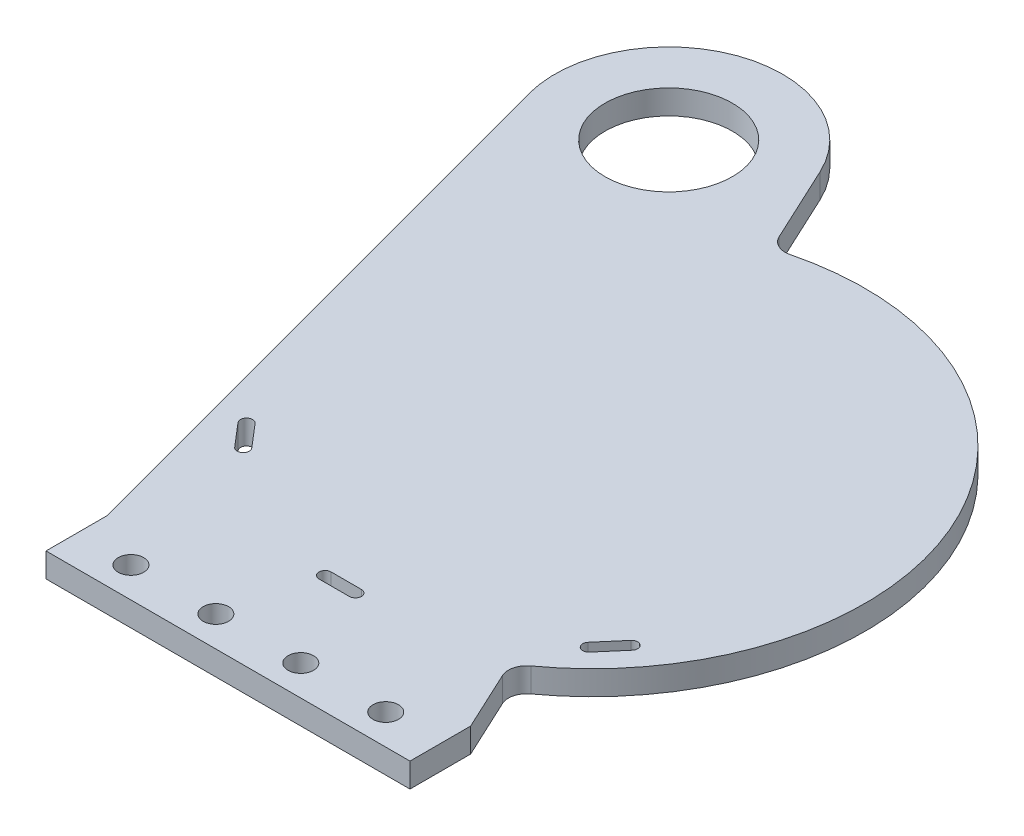
ISO-10303-21;
HEADER;
FILE_DESCRIPTION(('STEP AP214'),'2;1');
FILE_NAME('part.step','',(''),(''),'','','');
FILE_SCHEMA(('AUTOMOTIVE_DESIGN { 1 0 10303 214 1 1 1 1 }'));
ENDSEC;
DATA;
#1=APPLICATION_CONTEXT('core data for automotive mechanical design processes');
#2=APPLICATION_PROTOCOL_DEFINITION('international standard','automotive_design',2000,#1);
#3=PRODUCT_CONTEXT('',#1,'mechanical');
#4=PRODUCT('Part','Part','',(#3));
#5=PRODUCT_RELATED_PRODUCT_CATEGORY('part','',(#4));
#6=PRODUCT_DEFINITION_FORMATION('','',#4);
#7=PRODUCT_DEFINITION_CONTEXT('part definition',#1,'design');
#8=PRODUCT_DEFINITION('design','',#6,#7);
#9=PRODUCT_DEFINITION_SHAPE('','',#8);
#10=(LENGTH_UNIT() NAMED_UNIT(*) SI_UNIT(.MILLI.,.METRE.));
#11=(NAMED_UNIT(*) PLANE_ANGLE_UNIT() SI_UNIT($,.RADIAN.));
#12=(NAMED_UNIT(*) SI_UNIT($,.STERADIAN.) SOLID_ANGLE_UNIT());
#13=UNCERTAINTY_MEASURE_WITH_UNIT(LENGTH_MEASURE(1.E-05),#10,'distance_accuracy_value','');
#14=(GEOMETRIC_REPRESENTATION_CONTEXT(3) GLOBAL_UNCERTAINTY_ASSIGNED_CONTEXT((#13)) GLOBAL_UNIT_ASSIGNED_CONTEXT((#10,
#11,#12)) REPRESENTATION_CONTEXT('',''));
#15=CARTESIAN_POINT('',(0.,0.,0.));
#16=DIRECTION('',(0.,0.,1.));
#17=DIRECTION('',(1.,0.,0.));
#18=AXIS2_PLACEMENT_3D('',#15,#16,#17);
#19=CARTESIAN_POINT('',(-7.35232150739503,4.,-110.));
#20=DIRECTION('',(0.,-1.,0.));
#21=DIRECTION('',(0.,0.,-1.));
#22=AXIS2_PLACEMENT_3D('',#19,#20,#21);
#23=PLANE('',#22);
#24=CARTESIAN_POINT('',(51.,4.,-5.));
#25=DIRECTION('',(0.,-1.,0.));
#26=DIRECTION('',(0.,0.,-1.));
#27=AXIS2_PLACEMENT_3D('',#24,#25,#26);
#28=CIRCLE('',#27,2.1);
#29=CARTESIAN_POINT('',(51.,4.,-7.1));
#30=VERTEX_POINT('',#29);
#31=EDGE_CURVE('E678',#30,#30,#28,.T.);
#32=ORIENTED_EDGE('',*,*,#31,.T.);
#33=EDGE_LOOP('',(#32));
#34=FACE_BOUND('',#33,.T.);
#35=CARTESIAN_POINT('',(8.99999999999999,4.,-5.00000000000001));
#36=DIRECTION('',(0.,-1.,0.));
#37=DIRECTION('',(0.,0.,1.));
#38=AXIS2_PLACEMENT_3D('',#35,#36,#37);
#39=CIRCLE('',#38,2.1);
#40=CARTESIAN_POINT('',(8.99999999999999,4.,-2.90000000000001));
#41=VERTEX_POINT('',#40);
#42=EDGE_CURVE('E682',#41,#41,#39,.T.);
#43=ORIENTED_EDGE('',*,*,#42,.T.);
#44=EDGE_LOOP('',(#43));
#45=FACE_BOUND('',#44,.T.);
#46=CARTESIAN_POINT('',(23.,4.,-5.));
#47=DIRECTION('',(0.,-1.,0.));
#48=DIRECTION('',(0.,0.,1.));
#49=AXIS2_PLACEMENT_3D('',#46,#47,#48);
#50=CIRCLE('',#49,2.1);
#51=CARTESIAN_POINT('',(23.,4.,-2.9));
#52=VERTEX_POINT('',#51);
#53=EDGE_CURVE('E692',#52,#52,#50,.T.);
#54=ORIENTED_EDGE('',*,*,#53,.T.);
#55=EDGE_LOOP('',(#54));
#56=FACE_BOUND('',#55,.T.);
#57=CARTESIAN_POINT('',(37.,4.,-5.));
#58=DIRECTION('',(0.,-1.,0.));
#59=DIRECTION('',(0.,0.,-1.));
#60=AXIS2_PLACEMENT_3D('',#57,#58,#59);
#61=CIRCLE('',#60,2.1);
#62=CARTESIAN_POINT('',(37.,4.,-7.1));
#63=VERTEX_POINT('',#62);
#64=EDGE_CURVE('E212',#63,#63,#61,.T.);
#65=ORIENTED_EDGE('',*,*,#64,.T.);
#66=EDGE_LOOP('',(#65));
#67=FACE_BOUND('',#66,.T.);
#68=CARTESIAN_POINT('',(-1.73526570816677,4.,-34.7933954997494));
#69=DIRECTION('',(0.,1.,0.));
#70=DIRECTION('',(0.,0.,1.));
#71=AXIS2_PLACEMENT_3D('',#68,#69,#70);
#72=CIRCLE('',#71,0.999999999999995);
#73=CARTESIAN_POINT('',(-0.975772037280694,4.,-35.4439101912699));
#74=VERTEX_POINT('',#73);
#75=CARTESIAN_POINT('',(-2.49475937905283,4.,-34.1428808082289));
#76=VERTEX_POINT('',#75);
#77=EDGE_CURVE('E222',#74,#76,#72,.T.);
#78=ORIENTED_EDGE('',*,*,#77,.F.);
#79=DIRECTION('',(-0.650514691520489,0.,-0.759493670886074));
#80=VECTOR('',#79,1.);
#81=CARTESIAN_POINT('',(-0.975772037280694,4.,-35.4439101912699));
#82=LINE('',#81,#80);
#83=CARTESIAN_POINT('',(2.27680142032176,4.,-31.6464418368395));
#84=VERTEX_POINT('',#83);
#85=EDGE_CURVE('E230',#84,#74,#82,.T.);
#86=ORIENTED_EDGE('',*,*,#85,.F.);
#87=CARTESIAN_POINT('',(1.51730774943567,4.,-30.995927145319));
#88=DIRECTION('',(0.,1.,0.));
#89=DIRECTION('',(0.,0.,1.));
#90=AXIS2_PLACEMENT_3D('',#87,#88,#89);
#91=CIRCLE('',#90,1.);
#92=CARTESIAN_POINT('',(0.757814078549595,4.,-30.3454124537985));
#93=VERTEX_POINT('',#92);
#94=EDGE_CURVE('E227',#93,#84,#91,.T.);
#95=ORIENTED_EDGE('',*,*,#94,.F.);
#96=DIRECTION('',(0.650514691520486,0.,0.759493670886076));
#97=VECTOR('',#96,1.);
#98=CARTESIAN_POINT('',(-2.49475937905283,4.,-34.1428808082289));
#99=LINE('',#98,#97);
#100=EDGE_CURVE('E224',#76,#93,#99,.T.);
#101=ORIENTED_EDGE('',*,*,#100,.F.);
#102=EDGE_LOOP('',(#78,#86,#95,#101));
#103=FACE_BOUND('',#102,.T.);
#104=CARTESIAN_POINT('',(-7.35232150739503,4.,-110.));
#105=DIRECTION('',(0.,1.,0.));
#106=DIRECTION('',(0.,0.,1.));
#107=AXIS2_PLACEMENT_3D('',#104,#105,#106);
#108=CIRCLE('',#107,10.5);
#109=CARTESIAN_POINT('',(-7.35232150739503,4.,-99.5));
#110=VERTEX_POINT('',#109);
#111=EDGE_CURVE('E284',#110,#110,#108,.T.);
#112=ORIENTED_EDGE('',*,*,#111,.F.);
#113=EDGE_LOOP('',(#112));
#114=FACE_BOUND('',#113,.T.);
#115=DIRECTION('',(0.,0.,1.));
#116=VECTOR('',#115,1.);
#117=CARTESIAN_POINT('',(0.,4.,0.));
#118=LINE('',#117,#116);
#119=CARTESIAN_POINT('',(0.,4.,-10.));
#120=VERTEX_POINT('',#119);
#121=CARTESIAN_POINT('',(0.,4.,0.));
#122=VERTEX_POINT('',#121);
#123=EDGE_CURVE('E290',#120,#122,#118,.T.);
#124=ORIENTED_EDGE('',*,*,#123,.T.);
#125=DIRECTION('',(1.,0.,0.));
#126=VECTOR('',#125,1.);
#127=CARTESIAN_POINT('',(0.,4.,0.));
#128=LINE('',#127,#126);
#129=CARTESIAN_POINT('',(60.,4.,0.));
#130=VERTEX_POINT('',#129);
#131=EDGE_CURVE('E293',#122,#130,#128,.T.);
#132=ORIENTED_EDGE('',*,*,#131,.T.);
#133=DIRECTION('',(0.,0.,-1.));
#134=VECTOR('',#133,1.);
#135=CARTESIAN_POINT('',(60.,4.,0.));
#136=LINE('',#135,#134);
#137=CARTESIAN_POINT('',(60.,4.,-10.));
#138=VERTEX_POINT('',#137);
#139=EDGE_CURVE('E296',#130,#138,#136,.T.);
#140=ORIENTED_EDGE('',*,*,#139,.T.);
#141=DIRECTION('',(-0.422618261740701,0.,-0.906307787036649));
#142=VECTOR('',#141,1.);
#143=CARTESIAN_POINT('',(55.4118844835664,4.,-19.8392454770891));
#144=LINE('',#143,#142);
#145=CARTESIAN_POINT('',(55.4118844835664,4.,-19.8392454770891));
#146=VERTEX_POINT('',#145);
#147=EDGE_CURVE('E298',#138,#146,#144,.T.);
#148=ORIENTED_EDGE('',*,*,#147,.T.);
#149=CARTESIAN_POINT('',(58.1308078446763,4.,-21.1071002623114));
#150=DIRECTION('',(0.,-1.,0.));
#151=DIRECTION('',(0.,0.,-1.));
#152=AXIS2_PLACEMENT_3D('',#149,#150,#151);
#153=CIRCLE('',#152,3.);
#154=CARTESIAN_POINT('',(56.3726323543841,4.,-23.537906495917));
#155=VERTEX_POINT('',#154);
#156=EDGE_CURVE('E300',#146,#155,#153,.T.);
#157=ORIENTED_EDGE('',*,*,#156,.T.);
#158=CARTESIAN_POINT('',(30.,4.,-60.));
#159=DIRECTION('',(0.,1.,0.));
#160=DIRECTION('',(0.,0.,-1.));
#161=AXIS2_PLACEMENT_3D('',#158,#159,#160);
#162=CIRCLE('',#161,45.);
#163=CARTESIAN_POINT('',(19.020417198929,4.,-103.639990393152));
#164=VERTEX_POINT('',#163);
#165=EDGE_CURVE('E302',#155,#164,#162,.T.);
#166=ORIENTED_EDGE('',*,*,#165,.T.);
#167=CARTESIAN_POINT('',(18.2884450121907,4.,-106.549323086029));
#168=DIRECTION('',(0.,-1.,0.));
#169=DIRECTION('',(0.,0.,1.));
#170=AXIS2_PLACEMENT_3D('',#167,#168,#169);
#171=CIRCLE('',#170,2.99999999999996);
#172=CARTESIAN_POINT('',(15.5695216510807,4.,-105.281468300807));
#173=VERTEX_POINT('',#172);
#174=EDGE_CURVE('E304',#164,#173,#171,.T.);
#175=ORIENTED_EDGE('',*,*,#174,.T.);
#176=DIRECTION('',(-0.4226182617407,0.,-0.906307787036649));
#177=VECTOR('',#176,1.);
#178=CARTESIAN_POINT('',(9.66823596464235,4.,-117.936816295278));
#179=LINE('',#178,#177);
#180=CARTESIAN_POINT('',(9.66823596464235,4.,-117.936816295278));
#181=VERTEX_POINT('',#180);
#182=EDGE_CURVE('E306',#173,#181,#179,.T.);
#183=ORIENTED_EDGE('',*,*,#182,.T.);
#184=CARTESIAN_POINT('',(-7.35232150739503,4.,-110.));
#185=DIRECTION('',(0.,1.,0.));
#186=DIRECTION('',(0.,0.,-1.));
#187=AXIS2_PLACEMENT_3D('',#184,#185,#186);
#188=CIRCLE('',#187,18.780107283078);
#189=CARTESIAN_POINT('',(-25.4925121525996,4.,-105.139350566071));
#190=VERTEX_POINT('',#189);
#191=EDGE_CURVE('E308',#181,#190,#188,.T.);
#192=ORIENTED_EDGE('',*,*,#191,.T.);
#193=DIRECTION('',(0.258819045102515,0.,0.96592582628907));
#194=VECTOR('',#193,1.);
#195=CARTESIAN_POINT('',(0.,4.,-10.));
#196=LINE('',#195,#194);
#197=EDGE_CURVE('E310',#190,#120,#196,.T.);
#198=ORIENTED_EDGE('',*,*,#197,.T.);
#199=EDGE_LOOP('',(#124,#132,#140,#148,#157,#166,#175,#183,#192,#198));
#200=FACE_BOUND('',#199,.T.);
#201=CARTESIAN_POINT('',(26.5,4.,-19.5));
#202=DIRECTION('',(0.,1.,0.));
#203=DIRECTION('',(0.,0.,1.));
#204=AXIS2_PLACEMENT_3D('',#201,#202,#203);
#205=CIRCLE('',#204,1.);
#206=CARTESIAN_POINT('',(26.5,4.,-20.5));
#207=VERTEX_POINT('',#206);
#208=CARTESIAN_POINT('',(26.5,4.,-18.5));
#209=VERTEX_POINT('',#208);
#210=EDGE_CURVE('E253',#207,#209,#205,.T.);
#211=ORIENTED_EDGE('',*,*,#210,.F.);
#212=DIRECTION('',(-1.,0.,0.));
#213=VECTOR('',#212,1.);
#214=CARTESIAN_POINT('',(26.5,4.,-20.5));
#215=LINE('',#214,#213);
#216=CARTESIAN_POINT('',(31.5,4.,-20.5));
#217=VERTEX_POINT('',#216);
#218=EDGE_CURVE('E261',#217,#207,#215,.T.);
#219=ORIENTED_EDGE('',*,*,#218,.F.);
#220=CARTESIAN_POINT('',(31.5,4.,-19.5));
#221=DIRECTION('',(0.,1.,0.));
#222=DIRECTION('',(0.,0.,1.));
#223=AXIS2_PLACEMENT_3D('',#220,#221,#222);
#224=CIRCLE('',#223,0.999999999999999);
#225=CARTESIAN_POINT('',(31.5,4.,-18.5));
#226=VERTEX_POINT('',#225);
#227=EDGE_CURVE('E258',#226,#217,#224,.T.);
#228=ORIENTED_EDGE('',*,*,#227,.F.);
#229=DIRECTION('',(1.,0.,0.));
#230=VECTOR('',#229,1.);
#231=CARTESIAN_POINT('',(26.5,4.,-18.5));
#232=LINE('',#231,#230);
#233=EDGE_CURVE('E255',#209,#226,#232,.T.);
#234=ORIENTED_EDGE('',*,*,#233,.F.);
#235=EDGE_LOOP('',(#211,#219,#228,#234));
#236=FACE_BOUND('',#235,.T.);
#237=CARTESIAN_POINT('',(61.7352657081667,4.,-34.7933954997494));
#238=DIRECTION('',(0.,1.,0.));
#239=DIRECTION('',(0.,0.,-1.));
#240=AXIS2_PLACEMENT_3D('',#237,#238,#239);
#241=CIRCLE('',#240,0.999999999999999);
#242=CARTESIAN_POINT('',(62.4947593790528,4.,-34.1428808082289));
#243=VERTEX_POINT('',#242);
#244=CARTESIAN_POINT('',(60.9757720372807,4.,-35.4439101912699));
#245=VERTEX_POINT('',#244);
#246=EDGE_CURVE('E184',#243,#245,#241,.T.);
#247=ORIENTED_EDGE('',*,*,#246,.F.);
#248=DIRECTION('',(0.650514691520487,0.,-0.759493670886075));
#249=VECTOR('',#248,1.);
#250=CARTESIAN_POINT('',(62.4947593790528,4.,-34.1428808082289));
#251=LINE('',#250,#249);
#252=CARTESIAN_POINT('',(59.2421859214504,4.,-30.3454124537985));
#253=VERTEX_POINT('',#252);
#254=EDGE_CURVE('E206',#253,#243,#251,.T.);
#255=ORIENTED_EDGE('',*,*,#254,.F.);
#256=CARTESIAN_POINT('',(58.4826922505643,4.,-30.995927145319));
#257=DIRECTION('',(0.,1.,0.));
#258=DIRECTION('',(0.,0.,-1.));
#259=AXIS2_PLACEMENT_3D('',#256,#257,#258);
#260=CIRCLE('',#259,1.);
#261=CARTESIAN_POINT('',(57.7231985796782,4.,-31.6464418368395));
#262=VERTEX_POINT('',#261);
#263=EDGE_CURVE('E204',#262,#253,#260,.T.);
#264=ORIENTED_EDGE('',*,*,#263,.F.);
#265=DIRECTION('',(-0.650514691520488,0.,0.759493670886074));
#266=VECTOR('',#265,1.);
#267=CARTESIAN_POINT('',(60.9757720372807,4.,-35.4439101912699));
#268=LINE('',#267,#266);
#269=EDGE_CURVE('E192',#245,#262,#268,.T.);
#270=ORIENTED_EDGE('',*,*,#269,.F.);
#271=EDGE_LOOP('',(#247,#255,#264,#270));
#272=FACE_BOUND('',#271,.T.);
#273=ADVANCED_FACE('F35',(#34,#45,#56,#67,#103,#114,#200,#236,#272),#23,.F.);
#274=CARTESIAN_POINT('',(-7.35232150739503,0.,-110.));
#275=DIRECTION('',(0.,-1.,0.));
#276=DIRECTION('',(0.,0.,-1.));
#277=AXIS2_PLACEMENT_3D('',#274,#275,#276);
#278=PLANE('',#277);
#279=CARTESIAN_POINT('',(51.,0.,-5.));
#280=DIRECTION('',(0.,-1.,0.));
#281=DIRECTION('',(0.,0.,-1.));
#282=AXIS2_PLACEMENT_3D('',#279,#280,#281);
#283=CIRCLE('',#282,2.1);
#284=CARTESIAN_POINT('',(51.,0.,-7.1));
#285=VERTEX_POINT('',#284);
#286=EDGE_CURVE('E681',#285,#285,#283,.T.);
#287=ORIENTED_EDGE('',*,*,#286,.F.);
#288=EDGE_LOOP('',(#287));
#289=FACE_BOUND('',#288,.T.);
#290=CARTESIAN_POINT('',(8.99999999999999,0.,-5.00000000000001));
#291=DIRECTION('',(0.,-1.,0.));
#292=DIRECTION('',(0.,0.,1.));
#293=AXIS2_PLACEMENT_3D('',#290,#291,#292);
#294=CIRCLE('',#293,2.1);
#295=CARTESIAN_POINT('',(8.99999999999999,0.,-2.90000000000001));
#296=VERTEX_POINT('',#295);
#297=EDGE_CURVE('E687',#296,#296,#294,.T.);
#298=ORIENTED_EDGE('',*,*,#297,.F.);
#299=EDGE_LOOP('',(#298));
#300=FACE_BOUND('',#299,.T.);
#301=CARTESIAN_POINT('',(23.,0.,-5.));
#302=DIRECTION('',(0.,-1.,0.));
#303=DIRECTION('',(0.,0.,1.));
#304=AXIS2_PLACEMENT_3D('',#301,#302,#303);
#305=CIRCLE('',#304,2.1);
#306=CARTESIAN_POINT('',(23.,0.,-2.9));
#307=VERTEX_POINT('',#306);
#308=EDGE_CURVE('E695',#307,#307,#305,.T.);
#309=ORIENTED_EDGE('',*,*,#308,.F.);
#310=EDGE_LOOP('',(#309));
#311=FACE_BOUND('',#310,.T.);
#312=CARTESIAN_POINT('',(37.,0.,-5.));
#313=DIRECTION('',(0.,-1.,0.));
#314=DIRECTION('',(0.,0.,-1.));
#315=AXIS2_PLACEMENT_3D('',#312,#313,#314);
#316=CIRCLE('',#315,2.1);
#317=CARTESIAN_POINT('',(37.,0.,-7.1));
#318=VERTEX_POINT('',#317);
#319=EDGE_CURVE('E684',#318,#318,#316,.T.);
#320=ORIENTED_EDGE('',*,*,#319,.F.);
#321=EDGE_LOOP('',(#320));
#322=FACE_BOUND('',#321,.T.);
#323=DIRECTION('',(0.,0.,1.));
#324=VECTOR('',#323,1.);
#325=CARTESIAN_POINT('',(0.,0.,0.));
#326=LINE('',#325,#324);
#327=CARTESIAN_POINT('',(0.,0.,-10.));
#328=VERTEX_POINT('',#327);
#329=CARTESIAN_POINT('',(0.,0.,0.));
#330=VERTEX_POINT('',#329);
#331=EDGE_CURVE('E287',#328,#330,#326,.T.);
#332=ORIENTED_EDGE('',*,*,#331,.F.);
#333=DIRECTION('',(0.258819045102515,0.,0.96592582628907));
#334=VECTOR('',#333,1.);
#335=CARTESIAN_POINT('',(0.,0.,-10.));
#336=LINE('',#335,#334);
#337=CARTESIAN_POINT('',(-25.4925121525996,0.,-105.139350566071));
#338=VERTEX_POINT('',#337);
#339=EDGE_CURVE('E294',#338,#328,#336,.T.);
#340=ORIENTED_EDGE('',*,*,#339,.F.);
#341=CARTESIAN_POINT('',(-7.35232150739503,0.,-110.));
#342=DIRECTION('',(0.,1.,0.));
#343=DIRECTION('',(0.,0.,-1.));
#344=AXIS2_PLACEMENT_3D('',#341,#342,#343);
#345=CIRCLE('',#344,18.780107283078);
#346=CARTESIAN_POINT('',(9.66823596464235,0.,-117.936816295278));
#347=VERTEX_POINT('',#346);
#348=EDGE_CURVE('E329',#347,#338,#345,.T.);
#349=ORIENTED_EDGE('',*,*,#348,.F.);
#350=DIRECTION('',(-0.4226182617407,0.,-0.906307787036649));
#351=VECTOR('',#350,1.);
#352=CARTESIAN_POINT('',(9.66823596464235,0.,-117.936816295278));
#353=LINE('',#352,#351);
#354=CARTESIAN_POINT('',(15.5695216510807,0.,-105.281468300807));
#355=VERTEX_POINT('',#354);
#356=EDGE_CURVE('E327',#355,#347,#353,.T.);
#357=ORIENTED_EDGE('',*,*,#356,.F.);
#358=CARTESIAN_POINT('',(18.2884450121907,0.,-106.549323086029));
#359=DIRECTION('',(0.,-1.,0.));
#360=DIRECTION('',(0.,0.,1.));
#361=AXIS2_PLACEMENT_3D('',#358,#359,#360);
#362=CIRCLE('',#361,2.99999999999996);
#363=CARTESIAN_POINT('',(19.020417198929,0.,-103.639990393152));
#364=VERTEX_POINT('',#363);
#365=EDGE_CURVE('E325',#364,#355,#362,.T.);
#366=ORIENTED_EDGE('',*,*,#365,.F.);
#367=CARTESIAN_POINT('',(30.,0.,-60.));
#368=DIRECTION('',(0.,1.,0.));
#369=DIRECTION('',(0.,0.,-1.));
#370=AXIS2_PLACEMENT_3D('',#367,#368,#369);
#371=CIRCLE('',#370,45.);
#372=CARTESIAN_POINT('',(56.3726323543841,0.,-23.537906495917));
#373=VERTEX_POINT('',#372);
#374=EDGE_CURVE('E323',#373,#364,#371,.T.);
#375=ORIENTED_EDGE('',*,*,#374,.F.);
#376=CARTESIAN_POINT('',(58.1308078446763,0.,-21.1071002623114));
#377=DIRECTION('',(0.,-1.,0.));
#378=DIRECTION('',(0.,0.,-1.));
#379=AXIS2_PLACEMENT_3D('',#376,#377,#378);
#380=CIRCLE('',#379,3.);
#381=CARTESIAN_POINT('',(55.4118844835664,0.,-19.8392454770891));
#382=VERTEX_POINT('',#381);
#383=EDGE_CURVE('E321',#382,#373,#380,.T.);
#384=ORIENTED_EDGE('',*,*,#383,.F.);
#385=DIRECTION('',(-0.422618261740701,0.,-0.906307787036649));
#386=VECTOR('',#385,1.);
#387=CARTESIAN_POINT('',(55.4118844835664,0.,-19.8392454770891));
#388=LINE('',#387,#386);
#389=CARTESIAN_POINT('',(60.,0.,-10.));
#390=VERTEX_POINT('',#389);
#391=EDGE_CURVE('E319',#390,#382,#388,.T.);
#392=ORIENTED_EDGE('',*,*,#391,.F.);
#393=DIRECTION('',(0.,0.,-1.));
#394=VECTOR('',#393,1.);
#395=CARTESIAN_POINT('',(60.,0.,0.));
#396=LINE('',#395,#394);
#397=CARTESIAN_POINT('',(60.,0.,0.));
#398=VERTEX_POINT('',#397);
#399=EDGE_CURVE('E317',#398,#390,#396,.T.);
#400=ORIENTED_EDGE('',*,*,#399,.F.);
#401=DIRECTION('',(1.,0.,0.));
#402=VECTOR('',#401,1.);
#403=CARTESIAN_POINT('',(0.,0.,0.));
#404=LINE('',#403,#402);
#405=EDGE_CURVE('E315',#330,#398,#404,.T.);
#406=ORIENTED_EDGE('',*,*,#405,.F.);
#407=EDGE_LOOP('',(#332,#340,#349,#357,#366,#375,#384,#392,#400,#406));
#408=FACE_BOUND('',#407,.T.);
#409=CARTESIAN_POINT('',(-7.35232150739503,0.,-110.));
#410=DIRECTION('',(0.,1.,0.));
#411=DIRECTION('',(0.,0.,1.));
#412=AXIS2_PLACEMENT_3D('',#409,#410,#411);
#413=CIRCLE('',#412,10.5);
#414=CARTESIAN_POINT('',(-7.35232150739503,0.,-99.5));
#415=VERTEX_POINT('',#414);
#416=EDGE_CURVE('E283',#415,#415,#413,.T.);
#417=ORIENTED_EDGE('',*,*,#416,.T.);
#418=EDGE_LOOP('',(#417));
#419=FACE_BOUND('',#418,.T.);
#420=DIRECTION('',(-1.,0.,0.));
#421=VECTOR('',#420,1.);
#422=CARTESIAN_POINT('',(26.5,0.,-20.5));
#423=LINE('',#422,#421);
#424=CARTESIAN_POINT('',(31.5,0.,-20.5));
#425=VERTEX_POINT('',#424);
#426=CARTESIAN_POINT('',(26.5,0.,-20.5));
#427=VERTEX_POINT('',#426);
#428=EDGE_CURVE('E256',#425,#427,#423,.T.);
#429=ORIENTED_EDGE('',*,*,#428,.T.);
#430=CARTESIAN_POINT('',(26.5,0.,-19.5));
#431=DIRECTION('',(0.,1.,0.));
#432=DIRECTION('',(0.,0.,1.));
#433=AXIS2_PLACEMENT_3D('',#430,#431,#432);
#434=CIRCLE('',#433,1.);
#435=CARTESIAN_POINT('',(26.5,0.,-18.5));
#436=VERTEX_POINT('',#435);
#437=EDGE_CURVE('E252',#427,#436,#434,.T.);
#438=ORIENTED_EDGE('',*,*,#437,.T.);
#439=DIRECTION('',(1.,0.,0.));
#440=VECTOR('',#439,1.);
#441=CARTESIAN_POINT('',(26.5,0.,-18.5));
#442=LINE('',#441,#440);
#443=CARTESIAN_POINT('',(31.5,0.,-18.5));
#444=VERTEX_POINT('',#443);
#445=EDGE_CURVE('E266',#436,#444,#442,.T.);
#446=ORIENTED_EDGE('',*,*,#445,.T.);
#447=CARTESIAN_POINT('',(31.5,0.,-19.5));
#448=DIRECTION('',(0.,1.,0.));
#449=DIRECTION('',(0.,0.,1.));
#450=AXIS2_PLACEMENT_3D('',#447,#448,#449);
#451=CIRCLE('',#450,0.999999999999999);
#452=EDGE_CURVE('E269',#444,#425,#451,.T.);
#453=ORIENTED_EDGE('',*,*,#452,.T.);
#454=EDGE_LOOP('',(#429,#438,#446,#453));
#455=FACE_BOUND('',#454,.T.);
#456=DIRECTION('',(-0.650514691520489,0.,-0.759493670886074));
#457=VECTOR('',#456,1.);
#458=CARTESIAN_POINT('',(-0.975772037280694,0.,-35.4439101912699));
#459=LINE('',#458,#457);
#460=CARTESIAN_POINT('',(2.27680142032175,0.,-31.6464418368395));
#461=VERTEX_POINT('',#460);
#462=CARTESIAN_POINT('',(-0.975772037280692,0.,-35.4439101912699));
#463=VERTEX_POINT('',#462);
#464=EDGE_CURVE('E225',#461,#463,#459,.T.);
#465=ORIENTED_EDGE('',*,*,#464,.T.);
#466=CARTESIAN_POINT('',(-1.73526570816677,0.,-34.7933954997494));
#467=DIRECTION('',(0.,1.,0.));
#468=DIRECTION('',(0.,0.,1.));
#469=AXIS2_PLACEMENT_3D('',#466,#467,#468);
#470=CIRCLE('',#469,0.999999999999995);
#471=CARTESIAN_POINT('',(-2.49475937905283,0.,-34.1428808082289));
#472=VERTEX_POINT('',#471);
#473=EDGE_CURVE('E200',#463,#472,#470,.T.);
#474=ORIENTED_EDGE('',*,*,#473,.T.);
#475=DIRECTION('',(0.650514691520486,0.,0.759493670886076));
#476=VECTOR('',#475,1.);
#477=CARTESIAN_POINT('',(-2.49475937905283,0.,-34.1428808082289));
#478=LINE('',#477,#476);
#479=CARTESIAN_POINT('',(0.757814078549595,0.,-30.3454124537985));
#480=VERTEX_POINT('',#479);
#481=EDGE_CURVE('E235',#472,#480,#478,.T.);
#482=ORIENTED_EDGE('',*,*,#481,.T.);
#483=CARTESIAN_POINT('',(1.51730774943567,0.,-30.995927145319));
#484=DIRECTION('',(0.,1.,0.));
#485=DIRECTION('',(0.,0.,1.));
#486=AXIS2_PLACEMENT_3D('',#483,#484,#485);
#487=CIRCLE('',#486,1.);
#488=EDGE_CURVE('E238',#480,#461,#487,.T.);
#489=ORIENTED_EDGE('',*,*,#488,.T.);
#490=EDGE_LOOP('',(#465,#474,#482,#489));
#491=FACE_BOUND('',#490,.T.);
#492=DIRECTION('',(0.650514691520487,0.,-0.759493670886075));
#493=VECTOR('',#492,1.);
#494=CARTESIAN_POINT('',(62.4947593790528,0.,-34.1428808082289));
#495=LINE('',#494,#493);
#496=CARTESIAN_POINT('',(59.2421859214504,0.,-30.3454124537985));
#497=VERTEX_POINT('',#496);
#498=CARTESIAN_POINT('',(62.4947593790528,0.,-34.1428808082289));
#499=VERTEX_POINT('',#498);
#500=EDGE_CURVE('E193',#497,#499,#495,.T.);
#501=ORIENTED_EDGE('',*,*,#500,.T.);
#502=CARTESIAN_POINT('',(61.7352657081667,0.,-34.7933954997494));
#503=DIRECTION('',(0.,1.,0.));
#504=DIRECTION('',(0.,0.,-1.));
#505=AXIS2_PLACEMENT_3D('',#502,#503,#504);
#506=CIRCLE('',#505,0.999999999999999);
#507=CARTESIAN_POINT('',(60.9757720372807,0.,-35.4439101912699));
#508=VERTEX_POINT('',#507);
#509=EDGE_CURVE('E58',#499,#508,#506,.T.);
#510=ORIENTED_EDGE('',*,*,#509,.T.);
#511=DIRECTION('',(-0.650514691520488,0.,0.759493670886074));
#512=VECTOR('',#511,1.);
#513=CARTESIAN_POINT('',(60.9757720372807,0.,-35.4439101912699));
#514=LINE('',#513,#512);
#515=CARTESIAN_POINT('',(57.7231985796782,0.,-31.6464418368395));
#516=VERTEX_POINT('',#515);
#517=EDGE_CURVE('E199',#508,#516,#514,.T.);
#518=ORIENTED_EDGE('',*,*,#517,.T.);
#519=CARTESIAN_POINT('',(58.4826922505643,0.,-30.995927145319));
#520=DIRECTION('',(0.,1.,0.));
#521=DIRECTION('',(0.,0.,-1.));
#522=AXIS2_PLACEMENT_3D('',#519,#520,#521);
#523=CIRCLE('',#522,1.);
#524=EDGE_CURVE('E214',#516,#497,#523,.T.);
#525=ORIENTED_EDGE('',*,*,#524,.T.);
#526=EDGE_LOOP('',(#501,#510,#518,#525));
#527=FACE_BOUND('',#526,.T.);
#528=ADVANCED_FACE('F365',(#289,#300,#311,#322,#408,#419,#455,#491,#527),#278,.T.);
#529=CARTESIAN_POINT('',(0.,4.,0.));
#530=DIRECTION('',(1.,0.,0.));
#531=DIRECTION('',(0.,0.,-1.));
#532=AXIS2_PLACEMENT_3D('',#529,#530,#531);
#533=PLANE('',#532);
#534=ORIENTED_EDGE('',*,*,#331,.T.);
#535=DIRECTION('',(0.,-1.,0.));
#536=VECTOR('',#535,1.);
#537=CARTESIAN_POINT('',(0.,4.,0.));
#538=LINE('',#537,#536);
#539=EDGE_CURVE('E11',#122,#330,#538,.T.);
#540=ORIENTED_EDGE('',*,*,#539,.F.);
#541=ORIENTED_EDGE('',*,*,#123,.F.);
#542=DIRECTION('',(0.,-1.,0.));
#543=VECTOR('',#542,1.);
#544=CARTESIAN_POINT('',(0.,4.,-10.));
#545=LINE('',#544,#543);
#546=EDGE_CURVE('E312',#120,#328,#545,.T.);
#547=ORIENTED_EDGE('',*,*,#546,.T.);
#548=EDGE_LOOP('',(#534,#540,#541,#547));
#549=FACE_BOUND('',#548,.T.);
#550=ADVANCED_FACE('F37',(#549),#533,.F.);
#551=CARTESIAN_POINT('',(0.,4.,0.));
#552=DIRECTION('',(0.,0.,-1.));
#553=DIRECTION('',(-1.,0.,0.));
#554=AXIS2_PLACEMENT_3D('',#551,#552,#553);
#555=PLANE('',#554);
#556=ORIENTED_EDGE('',*,*,#405,.T.);
#557=DIRECTION('',(0.,-1.,0.));
#558=VECTOR('',#557,1.);
#559=CARTESIAN_POINT('',(60.,4.,0.));
#560=LINE('',#559,#558);
#561=EDGE_CURVE('E43',#130,#398,#560,.T.);
#562=ORIENTED_EDGE('',*,*,#561,.F.);
#563=ORIENTED_EDGE('',*,*,#131,.F.);
#564=ORIENTED_EDGE('',*,*,#539,.T.);
#565=EDGE_LOOP('',(#556,#562,#563,#564));
#566=FACE_BOUND('',#565,.T.);
#567=ADVANCED_FACE('F383',(#566),#555,.F.);
#568=CARTESIAN_POINT('',(60.,4.,0.));
#569=DIRECTION('',(-1.,0.,0.));
#570=DIRECTION('',(0.,0.,1.));
#571=AXIS2_PLACEMENT_3D('',#568,#569,#570);
#572=PLANE('',#571);
#573=ORIENTED_EDGE('',*,*,#399,.T.);
#574=DIRECTION('',(0.,-1.,0.));
#575=VECTOR('',#574,1.);
#576=CARTESIAN_POINT('',(60.,4.,-10.));
#577=LINE('',#576,#575);
#578=EDGE_CURVE('E352',#138,#390,#577,.T.);
#579=ORIENTED_EDGE('',*,*,#578,.F.);
#580=ORIENTED_EDGE('',*,*,#139,.F.);
#581=ORIENTED_EDGE('',*,*,#561,.T.);
#582=EDGE_LOOP('',(#573,#579,#580,#581));
#583=FACE_BOUND('',#582,.T.);
#584=ADVANCED_FACE('F359',(#583),#572,.F.);
#585=CARTESIAN_POINT('',(55.4118844835664,4.,-19.8392454770891));
#586=DIRECTION('',(-0.906307787036649,0.,0.422618261740701));
#587=DIRECTION('',(0.422618261740701,0.,0.906307787036649));
#588=AXIS2_PLACEMENT_3D('',#585,#586,#587);
#589=PLANE('',#588);
#590=ORIENTED_EDGE('',*,*,#391,.T.);
#591=DIRECTION('',(0.,-1.,0.));
#592=VECTOR('',#591,1.);
#593=CARTESIAN_POINT('',(55.4118844835664,4.,-19.8392454770891));
#594=LINE('',#593,#592);
#595=EDGE_CURVE('E349',#146,#382,#594,.T.);
#596=ORIENTED_EDGE('',*,*,#595,.F.);
#597=ORIENTED_EDGE('',*,*,#147,.F.);
#598=ORIENTED_EDGE('',*,*,#578,.T.);
#599=EDGE_LOOP('',(#590,#596,#597,#598));
#600=FACE_BOUND('',#599,.T.);
#601=ADVANCED_FACE('F371',(#600),#589,.F.);
#602=CARTESIAN_POINT('',(58.1308078446763,4.,-21.1071002623114));
#603=DIRECTION('',(0.,-1.,0.));
#604=DIRECTION('',(0.,0.,-1.));
#605=AXIS2_PLACEMENT_3D('',#602,#603,#604);
#606=CYLINDRICAL_SURFACE('',#605,3.);
#607=ORIENTED_EDGE('',*,*,#383,.T.);
#608=DIRECTION('',(0.,-1.,0.));
#609=VECTOR('',#608,1.);
#610=CARTESIAN_POINT('',(56.3726323543841,4.,-23.537906495917));
#611=LINE('',#610,#609);
#612=EDGE_CURVE('E346',#155,#373,#611,.T.);
#613=ORIENTED_EDGE('',*,*,#612,.F.);
#614=ORIENTED_EDGE('',*,*,#156,.F.);
#615=ORIENTED_EDGE('',*,*,#595,.T.);
#616=EDGE_LOOP('',(#607,#613,#614,#615));
#617=FACE_BOUND('',#616,.T.);
#618=ADVANCED_FACE('F375',(#617),#606,.F.);
#619=CARTESIAN_POINT('',(30.,4.,-60.));
#620=DIRECTION('',(0.,-1.,0.));
#621=DIRECTION('',(0.,0.,-1.));
#622=AXIS2_PLACEMENT_3D('',#619,#620,#621);
#623=CYLINDRICAL_SURFACE('',#622,45.);
#624=ORIENTED_EDGE('',*,*,#374,.T.);
#625=DIRECTION('',(0.,-1.,0.));
#626=VECTOR('',#625,1.);
#627=CARTESIAN_POINT('',(19.020417198929,4.,-103.639990393152));
#628=LINE('',#627,#626);
#629=EDGE_CURVE('E343',#164,#364,#628,.T.);
#630=ORIENTED_EDGE('',*,*,#629,.F.);
#631=ORIENTED_EDGE('',*,*,#165,.F.);
#632=ORIENTED_EDGE('',*,*,#612,.T.);
#633=EDGE_LOOP('',(#624,#630,#631,#632));
#634=FACE_BOUND('',#633,.T.);
#635=ADVANCED_FACE('F406',(#634),#623,.T.);
#636=CARTESIAN_POINT('',(18.2884450121907,4.,-106.549323086029));
#637=DIRECTION('',(0.,-1.,0.));
#638=DIRECTION('',(0.,0.,-1.));
#639=AXIS2_PLACEMENT_3D('',#636,#637,#638);
#640=CYLINDRICAL_SURFACE('',#639,2.99999999999996);
#641=ORIENTED_EDGE('',*,*,#365,.T.);
#642=DIRECTION('',(0.,-1.,0.));
#643=VECTOR('',#642,1.);
#644=CARTESIAN_POINT('',(15.5695216510807,4.,-105.281468300807));
#645=LINE('',#644,#643);
#646=EDGE_CURVE('E340',#173,#355,#645,.T.);
#647=ORIENTED_EDGE('',*,*,#646,.F.);
#648=ORIENTED_EDGE('',*,*,#174,.F.);
#649=ORIENTED_EDGE('',*,*,#629,.T.);
#650=EDGE_LOOP('',(#641,#647,#648,#649));
#651=FACE_BOUND('',#650,.T.);
#652=ADVANCED_FACE('F403',(#651),#640,.F.);
#653=CARTESIAN_POINT('',(9.66823596464235,4.,-117.936816295278));
#654=DIRECTION('',(-0.90630778703665,0.,0.4226182617407));
#655=DIRECTION('',(0.4226182617407,0.,0.906307787036649));
#656=AXIS2_PLACEMENT_3D('',#653,#654,#655);
#657=PLANE('',#656);
#658=ORIENTED_EDGE('',*,*,#356,.T.);
#659=DIRECTION('',(0.,-1.,0.));
#660=VECTOR('',#659,1.);
#661=CARTESIAN_POINT('',(9.66823596464235,4.,-117.936816295278));
#662=LINE('',#661,#660);
#663=EDGE_CURVE('E337',#181,#347,#662,.T.);
#664=ORIENTED_EDGE('',*,*,#663,.F.);
#665=ORIENTED_EDGE('',*,*,#182,.F.);
#666=ORIENTED_EDGE('',*,*,#646,.T.);
#667=EDGE_LOOP('',(#658,#664,#665,#666));
#668=FACE_BOUND('',#667,.T.);
#669=ADVANCED_FACE('F399',(#668),#657,.F.);
#670=CARTESIAN_POINT('',(-7.35232150739503,4.,-110.));
#671=DIRECTION('',(0.,-1.,0.));
#672=DIRECTION('',(0.,0.,-1.));
#673=AXIS2_PLACEMENT_3D('',#670,#671,#672);
#674=CYLINDRICAL_SURFACE('',#673,18.780107283078);
#675=ORIENTED_EDGE('',*,*,#348,.T.);
#676=DIRECTION('',(0.,-1.,0.));
#677=VECTOR('',#676,1.);
#678=CARTESIAN_POINT('',(-25.4925121525996,4.,-105.139350566071));
#679=LINE('',#678,#677);
#680=EDGE_CURVE('E334',#190,#338,#679,.T.);
#681=ORIENTED_EDGE('',*,*,#680,.F.);
#682=ORIENTED_EDGE('',*,*,#191,.F.);
#683=ORIENTED_EDGE('',*,*,#663,.T.);
#684=EDGE_LOOP('',(#675,#681,#682,#683));
#685=FACE_BOUND('',#684,.T.);
#686=ADVANCED_FACE('F395',(#685),#674,.T.);
#687=CARTESIAN_POINT('',(0.,4.,-10.));
#688=DIRECTION('',(0.96592582628907,0.,-0.258819045102515));
#689=DIRECTION('',(-0.258819045102515,0.,-0.96592582628907));
#690=AXIS2_PLACEMENT_3D('',#687,#688,#689);
#691=PLANE('',#690);
#692=ORIENTED_EDGE('',*,*,#339,.T.);
#693=ORIENTED_EDGE('',*,*,#546,.F.);
#694=ORIENTED_EDGE('',*,*,#197,.F.);
#695=ORIENTED_EDGE('',*,*,#680,.T.);
#696=EDGE_LOOP('',(#692,#693,#694,#695));
#697=FACE_BOUND('',#696,.T.);
#698=ADVANCED_FACE('F390',(#697),#691,.F.);
#699=CARTESIAN_POINT('',(-7.35232150739503,4.,-110.));
#700=DIRECTION('',(0.,-1.,0.));
#701=DIRECTION('',(0.,0.,-1.));
#702=AXIS2_PLACEMENT_3D('',#699,#700,#701);
#703=CYLINDRICAL_SURFACE('',#702,10.5);
#704=ORIENTED_EDGE('',*,*,#111,.T.);
#705=EDGE_LOOP('',(#704));
#706=FACE_BOUND('',#705,.T.);
#707=ORIENTED_EDGE('',*,*,#416,.F.);
#708=EDGE_LOOP('',(#707));
#709=FACE_BOUND('',#708,.T.);
#710=ADVANCED_FACE('F426',(#706,#709),#703,.F.);
#711=CARTESIAN_POINT('',(26.5,4.,-19.5));
#712=DIRECTION('',(0.,-1.,0.));
#713=DIRECTION('',(0.,0.,-1.));
#714=AXIS2_PLACEMENT_3D('',#711,#712,#713);
#715=CYLINDRICAL_SURFACE('',#714,1.);
#716=ORIENTED_EDGE('',*,*,#437,.F.);
#717=DIRECTION('',(0.,-1.,0.));
#718=VECTOR('',#717,1.);
#719=CARTESIAN_POINT('',(26.5,4.,-20.5));
#720=LINE('',#719,#718);
#721=EDGE_CURVE('E263',#207,#427,#720,.T.);
#722=ORIENTED_EDGE('',*,*,#721,.F.);
#723=ORIENTED_EDGE('',*,*,#210,.T.);
#724=DIRECTION('',(0.,-1.,0.));
#725=VECTOR('',#724,1.);
#726=CARTESIAN_POINT('',(26.5,4.,-18.5));
#727=LINE('',#726,#725);
#728=EDGE_CURVE('E280',#209,#436,#727,.T.);
#729=ORIENTED_EDGE('',*,*,#728,.T.);
#730=EDGE_LOOP('',(#716,#722,#723,#729));
#731=FACE_BOUND('',#730,.T.);
#732=ADVANCED_FACE('F452',(#731),#715,.F.);
#733=CARTESIAN_POINT('',(26.5,4.,-18.5));
#734=DIRECTION('',(0.,0.,-1.));
#735=DIRECTION('',(-1.,0.,0.));
#736=AXIS2_PLACEMENT_3D('',#733,#734,#735);
#737=PLANE('',#736);
#738=ORIENTED_EDGE('',*,*,#445,.F.);
#739=ORIENTED_EDGE('',*,*,#728,.F.);
#740=ORIENTED_EDGE('',*,*,#233,.T.);
#741=DIRECTION('',(0.,-1.,0.));
#742=VECTOR('',#741,1.);
#743=CARTESIAN_POINT('',(31.5,4.,-18.5));
#744=LINE('',#743,#742);
#745=EDGE_CURVE('E278',#226,#444,#744,.T.);
#746=ORIENTED_EDGE('',*,*,#745,.T.);
#747=EDGE_LOOP('',(#738,#739,#740,#746));
#748=FACE_BOUND('',#747,.T.);
#749=ADVANCED_FACE('F459',(#748),#737,.T.);
#750=CARTESIAN_POINT('',(31.5,4.,-19.5));
#751=DIRECTION('',(0.,-1.,0.));
#752=DIRECTION('',(0.,0.,-1.));
#753=AXIS2_PLACEMENT_3D('',#750,#751,#752);
#754=CYLINDRICAL_SURFACE('',#753,0.999999999999999);
#755=ORIENTED_EDGE('',*,*,#452,.F.);
#756=ORIENTED_EDGE('',*,*,#745,.F.);
#757=ORIENTED_EDGE('',*,*,#227,.T.);
#758=DIRECTION('',(0.,-1.,0.));
#759=VECTOR('',#758,1.);
#760=CARTESIAN_POINT('',(31.5,4.,-20.5));
#761=LINE('',#760,#759);
#762=EDGE_CURVE('E276',#217,#425,#761,.T.);
#763=ORIENTED_EDGE('',*,*,#762,.T.);
#764=EDGE_LOOP('',(#755,#756,#757,#763));
#765=FACE_BOUND('',#764,.T.);
#766=ADVANCED_FACE('F466',(#765),#754,.F.);
#767=CARTESIAN_POINT('',(26.5,4.,-20.5));
#768=DIRECTION('',(0.,0.,1.));
#769=DIRECTION('',(1.,0.,0.));
#770=AXIS2_PLACEMENT_3D('',#767,#768,#769);
#771=PLANE('',#770);
#772=ORIENTED_EDGE('',*,*,#428,.F.);
#773=ORIENTED_EDGE('',*,*,#762,.F.);
#774=ORIENTED_EDGE('',*,*,#218,.T.);
#775=ORIENTED_EDGE('',*,*,#721,.T.);
#776=EDGE_LOOP('',(#772,#773,#774,#775));
#777=FACE_BOUND('',#776,.T.);
#778=ADVANCED_FACE('F474',(#777),#771,.T.);
#779=CARTESIAN_POINT('',(-1.73526570816677,4.,-34.7933954997494));
#780=DIRECTION('',(0.,-1.,0.));
#781=DIRECTION('',(0.,0.,-1.));
#782=AXIS2_PLACEMENT_3D('',#779,#780,#781);
#783=CYLINDRICAL_SURFACE('',#782,0.999999999999995);
#784=ORIENTED_EDGE('',*,*,#473,.F.);
#785=DIRECTION('',(0.,-1.,0.));
#786=VECTOR('',#785,1.);
#787=CARTESIAN_POINT('',(-0.975772037280694,4.,-35.4439101912699));
#788=LINE('',#787,#786);
#789=EDGE_CURVE('E232',#74,#463,#788,.T.);
#790=ORIENTED_EDGE('',*,*,#789,.F.);
#791=ORIENTED_EDGE('',*,*,#77,.T.);
#792=DIRECTION('',(0.,-1.,0.));
#793=VECTOR('',#792,1.);
#794=CARTESIAN_POINT('',(-2.49475937905283,4.,-34.1428808082289));
#795=LINE('',#794,#793);
#796=EDGE_CURVE('E249',#76,#472,#795,.T.);
#797=ORIENTED_EDGE('',*,*,#796,.T.);
#798=EDGE_LOOP('',(#784,#790,#791,#797));
#799=FACE_BOUND('',#798,.T.);
#800=ADVANCED_FACE('F482',(#799),#783,.F.);
#801=CARTESIAN_POINT('',(-2.49475937905283,4.,-34.1428808082289));
#802=DIRECTION('',(0.759493670886076,0.,-0.650514691520486));
#803=DIRECTION('',(-0.650514691520486,0.,-0.759493670886076));
#804=AXIS2_PLACEMENT_3D('',#801,#802,#803);
#805=PLANE('',#804);
#806=ORIENTED_EDGE('',*,*,#481,.F.);
#807=ORIENTED_EDGE('',*,*,#796,.F.);
#808=ORIENTED_EDGE('',*,*,#100,.T.);
#809=DIRECTION('',(0.,-1.,0.));
#810=VECTOR('',#809,1.);
#811=CARTESIAN_POINT('',(0.757814078549595,4.,-30.3454124537985));
#812=LINE('',#811,#810);
#813=EDGE_CURVE('E247',#93,#480,#812,.T.);
#814=ORIENTED_EDGE('',*,*,#813,.T.);
#815=EDGE_LOOP('',(#806,#807,#808,#814));
#816=FACE_BOUND('',#815,.T.);
#817=ADVANCED_FACE('F490',(#816),#805,.T.);
#818=CARTESIAN_POINT('',(1.51730774943567,4.,-30.995927145319));
#819=DIRECTION('',(0.,-1.,0.));
#820=DIRECTION('',(0.,0.,-1.));
#821=AXIS2_PLACEMENT_3D('',#818,#819,#820);
#822=CYLINDRICAL_SURFACE('',#821,1.);
#823=ORIENTED_EDGE('',*,*,#488,.F.);
#824=ORIENTED_EDGE('',*,*,#813,.F.);
#825=ORIENTED_EDGE('',*,*,#94,.T.);
#826=DIRECTION('',(0.,-1.,0.));
#827=VECTOR('',#826,1.);
#828=CARTESIAN_POINT('',(2.27680142032175,4.,-31.6464418368395));
#829=LINE('',#828,#827);
#830=EDGE_CURVE('E245',#84,#461,#829,.T.);
#831=ORIENTED_EDGE('',*,*,#830,.T.);
#832=EDGE_LOOP('',(#823,#824,#825,#831));
#833=FACE_BOUND('',#832,.T.);
#834=ADVANCED_FACE('F498',(#833),#822,.F.);
#835=CARTESIAN_POINT('',(-0.975772037280694,4.,-35.4439101912699));
#836=DIRECTION('',(-0.759493670886074,0.,0.650514691520489));
#837=DIRECTION('',(0.650514691520489,0.,0.759493670886074));
#838=AXIS2_PLACEMENT_3D('',#835,#836,#837);
#839=PLANE('',#838);
#840=ORIENTED_EDGE('',*,*,#464,.F.);
#841=ORIENTED_EDGE('',*,*,#830,.F.);
#842=ORIENTED_EDGE('',*,*,#85,.T.);
#843=ORIENTED_EDGE('',*,*,#789,.T.);
#844=EDGE_LOOP('',(#840,#841,#842,#843));
#845=FACE_BOUND('',#844,.T.);
#846=ADVANCED_FACE('F506',(#845),#839,.T.);
#847=CARTESIAN_POINT('',(61.7352657081667,4.,-34.7933954997494));
#848=DIRECTION('',(0.,-1.,0.));
#849=DIRECTION('',(0.,0.,-1.));
#850=AXIS2_PLACEMENT_3D('',#847,#848,#849);
#851=CYLINDRICAL_SURFACE('',#850,0.999999999999999);
#852=ORIENTED_EDGE('',*,*,#509,.F.);
#853=DIRECTION('',(0.,-1.,0.));
#854=VECTOR('',#853,1.);
#855=CARTESIAN_POINT('',(62.4947593790528,4.,-34.1428808082289));
#856=LINE('',#855,#854);
#857=EDGE_CURVE('E188',#243,#499,#856,.T.);
#858=ORIENTED_EDGE('',*,*,#857,.F.);
#859=ORIENTED_EDGE('',*,*,#246,.T.);
#860=DIRECTION('',(0.,-1.,0.));
#861=VECTOR('',#860,1.);
#862=CARTESIAN_POINT('',(60.9757720372807,4.,-35.4439101912699));
#863=LINE('',#862,#861);
#864=EDGE_CURVE('E187',#245,#508,#863,.T.);
#865=ORIENTED_EDGE('',*,*,#864,.T.);
#866=EDGE_LOOP('',(#852,#858,#859,#865));
#867=FACE_BOUND('',#866,.T.);
#868=ADVANCED_FACE('F186',(#867),#851,.F.);
#869=CARTESIAN_POINT('',(60.9757720372807,4.,-35.4439101912699));
#870=DIRECTION('',(0.759493670886074,0.,0.650514691520488));
#871=DIRECTION('',(0.650514691520488,0.,-0.759493670886074));
#872=AXIS2_PLACEMENT_3D('',#869,#870,#871);
#873=PLANE('',#872);
#874=ORIENTED_EDGE('',*,*,#517,.F.);
#875=ORIENTED_EDGE('',*,*,#864,.F.);
#876=ORIENTED_EDGE('',*,*,#269,.T.);
#877=DIRECTION('',(0.,-1.,0.));
#878=VECTOR('',#877,1.);
#879=CARTESIAN_POINT('',(57.7231985796782,4.,-31.6464418368395));
#880=LINE('',#879,#878);
#881=EDGE_CURVE('E201',#262,#516,#880,.T.);
#882=ORIENTED_EDGE('',*,*,#881,.T.);
#883=EDGE_LOOP('',(#874,#875,#876,#882));
#884=FACE_BOUND('',#883,.T.);
#885=ADVANCED_FACE('F196',(#884),#873,.T.);
#886=CARTESIAN_POINT('',(58.4826922505643,4.,-30.995927145319));
#887=DIRECTION('',(0.,-1.,0.));
#888=DIRECTION('',(0.,0.,-1.));
#889=AXIS2_PLACEMENT_3D('',#886,#887,#888);
#890=CYLINDRICAL_SURFACE('',#889,1.);
#891=ORIENTED_EDGE('',*,*,#524,.F.);
#892=ORIENTED_EDGE('',*,*,#881,.F.);
#893=ORIENTED_EDGE('',*,*,#263,.T.);
#894=DIRECTION('',(0.,-1.,0.));
#895=VECTOR('',#894,1.);
#896=CARTESIAN_POINT('',(59.2421859214504,4.,-30.3454124537985));
#897=LINE('',#896,#895);
#898=EDGE_CURVE('E50',#253,#497,#897,.T.);
#899=ORIENTED_EDGE('',*,*,#898,.T.);
#900=EDGE_LOOP('',(#891,#892,#893,#899));
#901=FACE_BOUND('',#900,.T.);
#902=ADVANCED_FACE('F527',(#901),#890,.F.);
#903=CARTESIAN_POINT('',(62.4947593790528,4.,-34.1428808082289));
#904=DIRECTION('',(-0.759493670886075,0.,-0.650514691520487));
#905=DIRECTION('',(-0.650514691520487,0.,0.759493670886075));
#906=AXIS2_PLACEMENT_3D('',#903,#904,#905);
#907=PLANE('',#906);
#908=ORIENTED_EDGE('',*,*,#500,.F.);
#909=ORIENTED_EDGE('',*,*,#898,.F.);
#910=ORIENTED_EDGE('',*,*,#254,.T.);
#911=ORIENTED_EDGE('',*,*,#857,.T.);
#912=EDGE_LOOP('',(#908,#909,#910,#911));
#913=FACE_BOUND('',#912,.T.);
#914=ADVANCED_FACE('F534',(#913),#907,.T.);
#915=CARTESIAN_POINT('',(37.,4.,-5.));
#916=DIRECTION('',(0.,-1.,0.));
#917=DIRECTION('',(0.,0.,-1.));
#918=AXIS2_PLACEMENT_3D('',#915,#916,#917);
#919=CYLINDRICAL_SURFACE('',#918,2.1);
#920=ORIENTED_EDGE('',*,*,#64,.F.);
#921=EDGE_LOOP('',(#920));
#922=FACE_BOUND('',#921,.T.);
#923=ORIENTED_EDGE('',*,*,#319,.T.);
#924=EDGE_LOOP('',(#923));
#925=FACE_BOUND('',#924,.T.);
#926=ADVANCED_FACE('F542',(#922,#925),#919,.F.);
#927=CARTESIAN_POINT('',(23.,4.,-5.));
#928=DIRECTION('',(0.,-1.,0.));
#929=DIRECTION('',(0.,0.,-1.));
#930=AXIS2_PLACEMENT_3D('',#927,#928,#929);
#931=CYLINDRICAL_SURFACE('',#930,2.1);
#932=ORIENTED_EDGE('',*,*,#53,.F.);
#933=EDGE_LOOP('',(#932));
#934=FACE_BOUND('',#933,.T.);
#935=ORIENTED_EDGE('',*,*,#308,.T.);
#936=EDGE_LOOP('',(#935));
#937=FACE_BOUND('',#936,.T.);
#938=ADVANCED_FACE('F549',(#934,#937),#931,.F.);
#939=CARTESIAN_POINT('',(8.99999999999999,4.,-5.00000000000001));
#940=DIRECTION('',(0.,-1.,0.));
#941=DIRECTION('',(0.,0.,-1.));
#942=AXIS2_PLACEMENT_3D('',#939,#940,#941);
#943=CYLINDRICAL_SURFACE('',#942,2.1);
#944=ORIENTED_EDGE('',*,*,#42,.F.);
#945=EDGE_LOOP('',(#944));
#946=FACE_BOUND('',#945,.T.);
#947=ORIENTED_EDGE('',*,*,#297,.T.);
#948=EDGE_LOOP('',(#947));
#949=FACE_BOUND('',#948,.T.);
#950=ADVANCED_FACE('F558',(#946,#949),#943,.F.);
#951=CARTESIAN_POINT('',(51.,4.,-5.));
#952=DIRECTION('',(0.,-1.,0.));
#953=DIRECTION('',(0.,0.,-1.));
#954=AXIS2_PLACEMENT_3D('',#951,#952,#953);
#955=CYLINDRICAL_SURFACE('',#954,2.1);
#956=ORIENTED_EDGE('',*,*,#31,.F.);
#957=EDGE_LOOP('',(#956));
#958=FACE_BOUND('',#957,.T.);
#959=ORIENTED_EDGE('',*,*,#286,.T.);
#960=EDGE_LOOP('',(#959));
#961=FACE_BOUND('',#960,.T.);
#962=ADVANCED_FACE('F566',(#958,#961),#955,.F.);
#963=CLOSED_SHELL('',(#273,#528,#550,#567,#584,#601,#618,#635,#652,#669,#686,#698,#710,#732,
#749,#766,#778,#800,#817,#834,#846,#868,#885,#902,#914,#926,#938,#950,#962));
#964=MANIFOLD_SOLID_BREP('B2',#963);
#965=ADVANCED_BREP_SHAPE_REPRESENTATION('',(#18,#964),#14);
#966=SHAPE_DEFINITION_REPRESENTATION(#9,#965);
ENDSEC;
END-ISO-10303-21;
